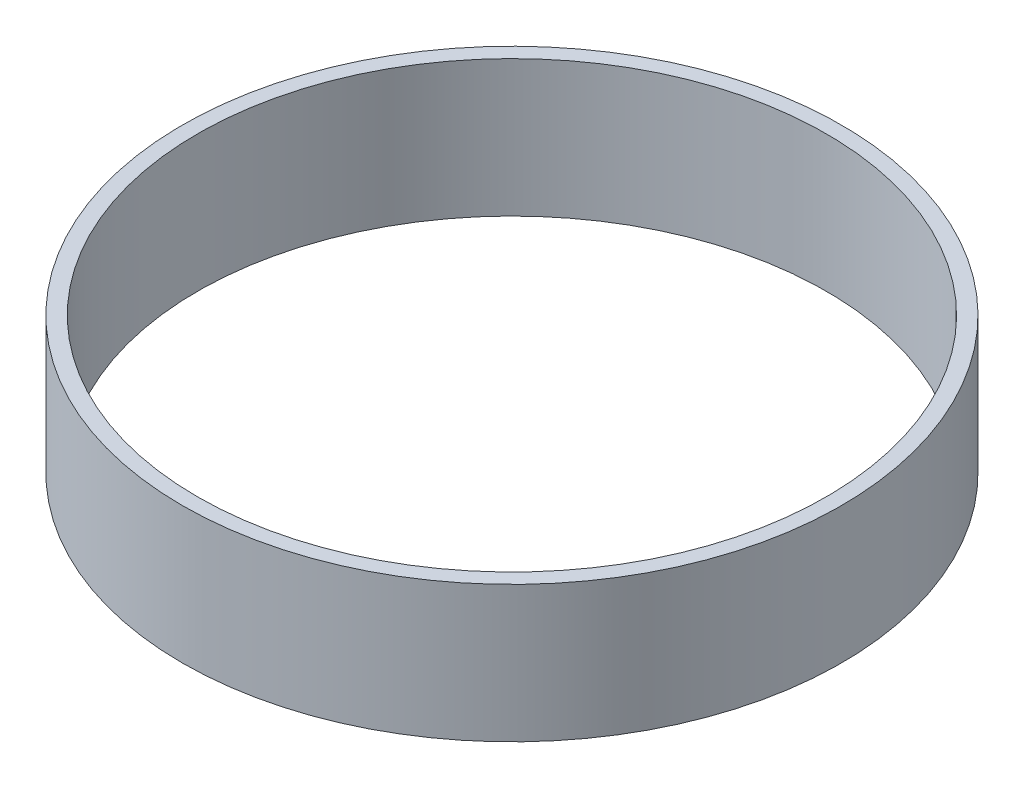
ISO-10303-21;
HEADER;
FILE_DESCRIPTION(('STEP AP214'),'2;1');
FILE_NAME('part.step','',(''),(''),'','','');
FILE_SCHEMA(('AUTOMOTIVE_DESIGN { 1 0 10303 214 1 1 1 1 }'));
ENDSEC;
DATA;
#1=APPLICATION_CONTEXT('core data for automotive mechanical design processes');
#2=APPLICATION_PROTOCOL_DEFINITION('international standard','automotive_design',2000,#1);
#3=PRODUCT_CONTEXT('',#1,'mechanical');
#4=PRODUCT('Part','Part','',(#3));
#5=PRODUCT_RELATED_PRODUCT_CATEGORY('part','',(#4));
#6=PRODUCT_DEFINITION_FORMATION('','',#4);
#7=PRODUCT_DEFINITION_CONTEXT('part definition',#1,'design');
#8=PRODUCT_DEFINITION('design','',#6,#7);
#9=PRODUCT_DEFINITION_SHAPE('','',#8);
#10=(LENGTH_UNIT() NAMED_UNIT(*) SI_UNIT(.MILLI.,.METRE.));
#11=(NAMED_UNIT(*) PLANE_ANGLE_UNIT() SI_UNIT($,.RADIAN.));
#12=(NAMED_UNIT(*) SI_UNIT($,.STERADIAN.) SOLID_ANGLE_UNIT());
#13=UNCERTAINTY_MEASURE_WITH_UNIT(LENGTH_MEASURE(1.E-05),#10,'distance_accuracy_value','');
#14=(GEOMETRIC_REPRESENTATION_CONTEXT(3) GLOBAL_UNCERTAINTY_ASSIGNED_CONTEXT((#13)) GLOBAL_UNIT_ASSIGNED_CONTEXT((#10,
#11,#12)) REPRESENTATION_CONTEXT('',''));
#15=CARTESIAN_POINT('',(0.,0.,0.));
#16=DIRECTION('',(0.,0.,1.));
#17=DIRECTION('',(1.,0.,0.));
#18=AXIS2_PLACEMENT_3D('',#15,#16,#17);
#19=CARTESIAN_POINT('',(0.,18.,0.));
#20=DIRECTION('',(0.,1.,0.));
#21=DIRECTION('',(0.,0.,1.));
#22=AXIS2_PLACEMENT_3D('',#19,#20,#21);
#23=PLANE('',#22);
#24=CARTESIAN_POINT('',(0.,18.,0.));
#25=DIRECTION('',(0.,1.,0.));
#26=DIRECTION('',(0.,0.,1.));
#27=AXIS2_PLACEMENT_3D('',#24,#25,#26);
#28=CIRCLE('',#27,43.5);
#29=CARTESIAN_POINT('',(0.,18.,43.5));
#30=VERTEX_POINT('',#29);
#31=EDGE_CURVE('E10',#30,#30,#28,.T.);
#32=ORIENTED_EDGE('',*,*,#31,.T.);
#33=EDGE_LOOP('',(#32));
#34=FACE_BOUND('',#33,.T.);
#35=CARTESIAN_POINT('',(0.,18.,0.));
#36=DIRECTION('',(0.,1.,0.));
#37=DIRECTION('',(0.,0.,1.));
#38=AXIS2_PLACEMENT_3D('',#35,#36,#37);
#39=CIRCLE('',#38,41.5);
#40=CARTESIAN_POINT('',(0.,18.,41.5));
#41=VERTEX_POINT('',#40);
#42=EDGE_CURVE('E50',#41,#41,#39,.T.);
#43=ORIENTED_EDGE('',*,*,#42,.F.);
#44=EDGE_LOOP('',(#43));
#45=FACE_BOUND('',#44,.T.);
#46=ADVANCED_FACE('F37',(#34,#45),#23,.T.);
#47=CARTESIAN_POINT('',(0.,0.,0.));
#48=DIRECTION('',(0.,1.,0.));
#49=DIRECTION('',(0.,0.,1.));
#50=AXIS2_PLACEMENT_3D('',#47,#48,#49);
#51=PLANE('',#50);
#52=CARTESIAN_POINT('',(0.,0.,0.));
#53=DIRECTION('',(0.,1.,0.));
#54=DIRECTION('',(0.,0.,1.));
#55=AXIS2_PLACEMENT_3D('',#52,#53,#54);
#56=CIRCLE('',#55,43.5);
#57=CARTESIAN_POINT('',(0.,0.,43.5));
#58=VERTEX_POINT('',#57);
#59=EDGE_CURVE('E41',#58,#58,#56,.T.);
#60=ORIENTED_EDGE('',*,*,#59,.F.);
#61=EDGE_LOOP('',(#60));
#62=FACE_BOUND('',#61,.T.);
#63=CARTESIAN_POINT('',(0.,0.,0.));
#64=DIRECTION('',(0.,1.,0.));
#65=DIRECTION('',(0.,0.,1.));
#66=AXIS2_PLACEMENT_3D('',#63,#64,#65);
#67=CIRCLE('',#66,41.5);
#68=CARTESIAN_POINT('',(0.,0.,41.5));
#69=VERTEX_POINT('',#68);
#70=EDGE_CURVE('E52',#69,#69,#67,.T.);
#71=ORIENTED_EDGE('',*,*,#70,.T.);
#72=EDGE_LOOP('',(#71));
#73=FACE_BOUND('',#72,.T.);
#74=ADVANCED_FACE('F64',(#62,#73),#51,.F.);
#75=CARTESIAN_POINT('',(0.,18.,0.));
#76=DIRECTION('',(0.,-1.,0.));
#77=DIRECTION('',(0.,0.,-1.));
#78=AXIS2_PLACEMENT_3D('',#75,#76,#77);
#79=CYLINDRICAL_SURFACE('',#78,43.5);
#80=ORIENTED_EDGE('',*,*,#31,.F.);
#81=EDGE_LOOP('',(#80));
#82=FACE_BOUND('',#81,.T.);
#83=ORIENTED_EDGE('',*,*,#59,.T.);
#84=EDGE_LOOP('',(#83));
#85=FACE_BOUND('',#84,.T.);
#86=ADVANCED_FACE('F39',(#82,#85),#79,.T.);
#87=CARTESIAN_POINT('',(0.,18.,0.));
#88=DIRECTION('',(0.,-1.,0.));
#89=DIRECTION('',(0.,0.,-1.));
#90=AXIS2_PLACEMENT_3D('',#87,#88,#89);
#91=CYLINDRICAL_SURFACE('',#90,41.5);
#92=ORIENTED_EDGE('',*,*,#42,.T.);
#93=EDGE_LOOP('',(#92));
#94=FACE_BOUND('',#93,.T.);
#95=ORIENTED_EDGE('',*,*,#70,.F.);
#96=EDGE_LOOP('',(#95));
#97=FACE_BOUND('',#96,.T.);
#98=ADVANCED_FACE('F60',(#94,#97),#91,.F.);
#99=CLOSED_SHELL('',(#46,#74,#86,#98));
#100=MANIFOLD_SOLID_BREP('B2',#99);
#101=ADVANCED_BREP_SHAPE_REPRESENTATION('',(#18,#100),#14);
#102=SHAPE_DEFINITION_REPRESENTATION(#9,#101);
ENDSEC;
END-ISO-10303-21;
